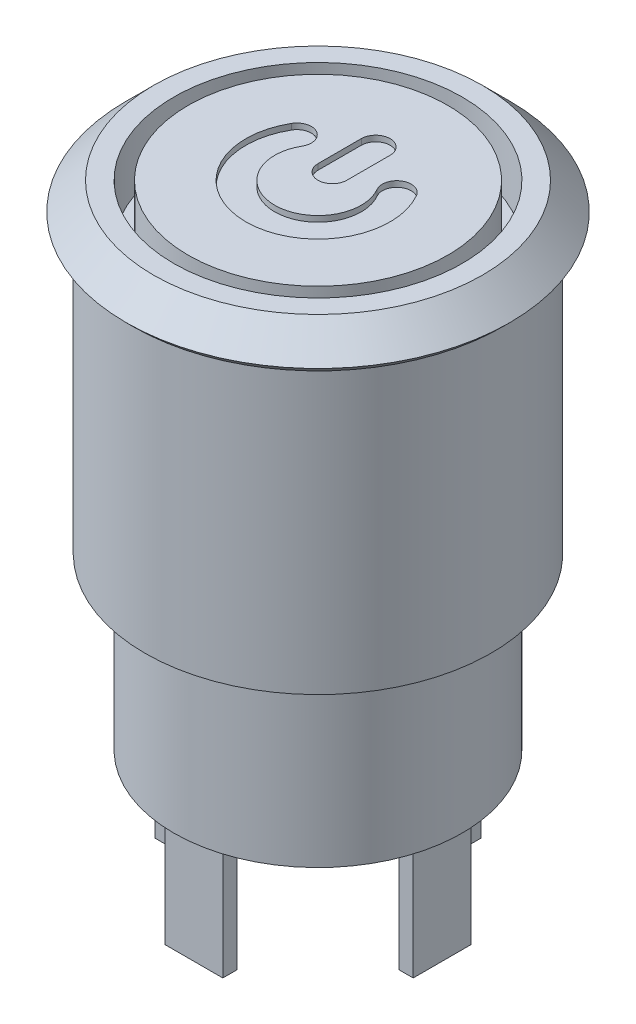
ISO-10303-21;
HEADER;
FILE_DESCRIPTION(('STEP AP214'),'2;1');
FILE_NAME('part.step','',(''),(''),'','','');
FILE_SCHEMA(('AUTOMOTIVE_DESIGN { 1 0 10303 214 1 1 1 1 }'));
ENDSEC;
DATA;
#1=APPLICATION_CONTEXT('core data for automotive mechanical design processes');
#2=APPLICATION_PROTOCOL_DEFINITION('international standard','automotive_design',2000,#1);
#3=PRODUCT_CONTEXT('',#1,'mechanical');
#4=PRODUCT('Part','Part','',(#3));
#5=PRODUCT_RELATED_PRODUCT_CATEGORY('part','',(#4));
#6=PRODUCT_DEFINITION_FORMATION('','',#4);
#7=PRODUCT_DEFINITION_CONTEXT('part definition',#1,'design');
#8=PRODUCT_DEFINITION('design','',#6,#7);
#9=PRODUCT_DEFINITION_SHAPE('','',#8);
#10=(LENGTH_UNIT() NAMED_UNIT(*) SI_UNIT(.MILLI.,.METRE.));
#11=(NAMED_UNIT(*) PLANE_ANGLE_UNIT() SI_UNIT($,.RADIAN.));
#12=(NAMED_UNIT(*) SI_UNIT($,.STERADIAN.) SOLID_ANGLE_UNIT());
#13=UNCERTAINTY_MEASURE_WITH_UNIT(LENGTH_MEASURE(1.E-05),#10,'distance_accuracy_value','');
#14=(GEOMETRIC_REPRESENTATION_CONTEXT(3) GLOBAL_UNCERTAINTY_ASSIGNED_CONTEXT((#13)) GLOBAL_UNIT_ASSIGNED_CONTEXT((#10,
#11,#12)) REPRESENTATION_CONTEXT('',''));
#15=CARTESIAN_POINT('',(0.,0.,0.));
#16=DIRECTION('',(0.,0.,1.));
#17=DIRECTION('',(1.,0.,0.));
#18=AXIS2_PLACEMENT_3D('',#15,#16,#17);
#19=CARTESIAN_POINT('',(0.,-5.9,0.));
#20=DIRECTION('',(0.,-1.,0.));
#21=DIRECTION('',(0.,0.,-1.));
#22=AXIS2_PLACEMENT_3D('',#19,#20,#21);
#23=PLANE('',#22);
#24=CARTESIAN_POINT('',(0.,-5.9,0.));
#25=DIRECTION('',(0.,-1.,0.));
#26=DIRECTION('',(0.,0.,-1.));
#27=AXIS2_PLACEMENT_3D('',#24,#25,#26);
#28=CIRCLE('',#27,5.);
#29=CARTESIAN_POINT('',(0.,-5.9,-5.));
#30=VERTEX_POINT('',#29);
#31=EDGE_CURVE('E319',#30,#30,#28,.T.);
#32=ORIENTED_EDGE('',*,*,#31,.T.);
#33=EDGE_LOOP('',(#32));
#34=FACE_BOUND('',#33,.T.);
#35=DIRECTION('',(-1.,0.,0.));
#36=VECTOR('',#35,1.);
#37=CARTESIAN_POINT('',(-1.,-5.9,4.3));
#38=LINE('',#37,#36);
#39=CARTESIAN_POINT('',(0.999999999999998,-5.9,4.3));
#40=VERTEX_POINT('',#39);
#41=CARTESIAN_POINT('',(-1.,-5.9,4.3));
#42=VERTEX_POINT('',#41);
#43=EDGE_CURVE('E304',#40,#42,#38,.T.);
#44=ORIENTED_EDGE('',*,*,#43,.F.);
#45=DIRECTION('',(0.,0.,1.));
#46=VECTOR('',#45,1.);
#47=CARTESIAN_POINT('',(0.999999999999998,-5.9,4.3));
#48=LINE('',#47,#46);
#49=CARTESIAN_POINT('',(0.999999999999999,-5.9,3.8));
#50=VERTEX_POINT('',#49);
#51=EDGE_CURVE('E290',#50,#40,#48,.T.);
#52=ORIENTED_EDGE('',*,*,#51,.F.);
#53=DIRECTION('',(1.,0.,0.));
#54=VECTOR('',#53,1.);
#55=CARTESIAN_POINT('',(-1.,-5.9,3.8));
#56=LINE('',#55,#54);
#57=CARTESIAN_POINT('',(-1.,-5.9,3.8));
#58=VERTEX_POINT('',#57);
#59=EDGE_CURVE('E295',#58,#50,#56,.T.);
#60=ORIENTED_EDGE('',*,*,#59,.F.);
#61=DIRECTION('',(0.,0.,-1.));
#62=VECTOR('',#61,1.);
#63=CARTESIAN_POINT('',(-1.,-5.9,4.3));
#64=LINE('',#63,#62);
#65=EDGE_CURVE('E306',#42,#58,#64,.T.);
#66=ORIENTED_EDGE('',*,*,#65,.F.);
#67=EDGE_LOOP('',(#44,#52,#60,#66));
#68=FACE_BOUND('',#67,.T.);
#69=DIRECTION('',(-1.,0.,0.));
#70=VECTOR('',#69,1.);
#71=CARTESIAN_POINT('',(-1.27706314817435,-5.9,-3.8));
#72=LINE('',#71,#70);
#73=CARTESIAN_POINT('',(1.27706314817435,-5.9,-3.8));
#74=VERTEX_POINT('',#73);
#75=CARTESIAN_POINT('',(-1.27706314817435,-5.9,-3.8));
#76=VERTEX_POINT('',#75);
#77=EDGE_CURVE('E275',#74,#76,#72,.T.);
#78=ORIENTED_EDGE('',*,*,#77,.F.);
#79=DIRECTION('',(0.,0.,1.));
#80=VECTOR('',#79,1.);
#81=CARTESIAN_POINT('',(1.27706314817435,-5.9,-3.8));
#82=LINE('',#81,#80);
#83=CARTESIAN_POINT('',(1.27706314817435,-5.9,-4.38101711650423));
#84=VERTEX_POINT('',#83);
#85=EDGE_CURVE('E261',#84,#74,#82,.T.);
#86=ORIENTED_EDGE('',*,*,#85,.F.);
#87=DIRECTION('',(1.,0.,0.));
#88=VECTOR('',#87,1.);
#89=CARTESIAN_POINT('',(-1.27706314817435,-5.9,-4.38101711650423));
#90=LINE('',#89,#88);
#91=CARTESIAN_POINT('',(-1.27706314817435,-5.9,-4.38101711650423));
#92=VERTEX_POINT('',#91);
#93=EDGE_CURVE('E266',#92,#84,#90,.T.);
#94=ORIENTED_EDGE('',*,*,#93,.F.);
#95=DIRECTION('',(0.,0.,-1.));
#96=VECTOR('',#95,1.);
#97=CARTESIAN_POINT('',(-1.27706314817435,-5.9,-3.8));
#98=LINE('',#97,#96);
#99=EDGE_CURVE('E277',#76,#92,#98,.T.);
#100=ORIENTED_EDGE('',*,*,#99,.F.);
#101=EDGE_LOOP('',(#78,#86,#94,#100));
#102=FACE_BOUND('',#101,.T.);
#103=DIRECTION('',(-1.37910516340156E-13,0.,1.));
#104=VECTOR('',#103,1.);
#105=CARTESIAN_POINT('',(4.30000000000034,-5.9,1.0000000000014));
#106=LINE('',#105,#104);
#107=CARTESIAN_POINT('',(4.30000000000061,-5.9,-0.999999999998596));
#108=VERTEX_POINT('',#107);
#109=CARTESIAN_POINT('',(4.30000000000034,-5.9,1.0000000000014));
#110=VERTEX_POINT('',#109);
#111=EDGE_CURVE('E233',#108,#110,#106,.T.);
#112=ORIENTED_EDGE('',*,*,#111,.F.);
#113=DIRECTION('',(1.,0.,1.37476835471162E-13));
#114=VECTOR('',#113,1.);
#115=CARTESIAN_POINT('',(4.30000000000061,-5.9,-0.999999999998596));
#116=LINE('',#115,#114);
#117=CARTESIAN_POINT('',(3.80000000000061,-5.9,-0.999999999998665));
#118=VERTEX_POINT('',#117);
#119=EDGE_CURVE('E230',#118,#108,#116,.T.);
#120=ORIENTED_EDGE('',*,*,#119,.F.);
#121=DIRECTION('',(1.37693675905659E-13,0.,-1.));
#122=VECTOR('',#121,1.);
#123=CARTESIAN_POINT('',(3.80000000000034,-5.9,1.00000000000134));
#124=LINE('',#123,#122);
#125=CARTESIAN_POINT('',(3.80000000000034,-5.9,1.00000000000134));
#126=VERTEX_POINT('',#125);
#127=EDGE_CURVE('E242',#126,#118,#124,.T.);
#128=ORIENTED_EDGE('',*,*,#127,.F.);
#129=DIRECTION('',(-1.,0.,-1.37476835471162E-13));
#130=VECTOR('',#129,1.);
#131=CARTESIAN_POINT('',(4.30000000000034,-5.9,1.0000000000014));
#132=LINE('',#131,#130);
#133=EDGE_CURVE('E250',#110,#126,#132,.T.);
#134=ORIENTED_EDGE('',*,*,#133,.F.);
#135=EDGE_LOOP('',(#112,#120,#128,#134));
#136=FACE_BOUND('',#135,.T.);
#137=DIRECTION('',(1.,0.,1.38087086395404E-13));
#138=VECTOR('',#137,1.);
#139=CARTESIAN_POINT('',(-3.79999999999935,-5.9,-1.27706314817406));
#140=LINE('',#139,#138);
#141=CARTESIAN_POINT('',(-4.38101711650357,-5.9,-1.27706314817414));
#142=VERTEX_POINT('',#141);
#143=CARTESIAN_POINT('',(-3.79999999999935,-5.9,-1.27706314817406));
#144=VERTEX_POINT('',#143);
#145=EDGE_CURVE('E852',#142,#144,#140,.T.);
#146=ORIENTED_EDGE('',*,*,#145,.F.);
#147=DIRECTION('',(1.37874492004061E-13,0.,-1.));
#148=VECTOR('',#147,1.);
#149=CARTESIAN_POINT('',(-4.38101711650393,-5.9,1.27706314817456));
#150=LINE('',#149,#148);
#151=CARTESIAN_POINT('',(-4.38101711650393,-5.9,1.27706314817456));
#152=VERTEX_POINT('',#151);
#153=EDGE_CURVE('E228',#152,#142,#150,.T.);
#154=ORIENTED_EDGE('',*,*,#153,.F.);
#155=DIRECTION('',(-1.,0.,-1.37713878053795E-13));
#156=VECTOR('',#155,1.);
#157=CARTESIAN_POINT('',(-3.7999999999997,-5.9,1.27706314817464));
#158=LINE('',#157,#156);
#159=CARTESIAN_POINT('',(-3.7999999999997,-5.9,1.27706314817464));
#160=VERTEX_POINT('',#159);
#161=EDGE_CURVE('E224',#160,#152,#158,.T.);
#162=ORIENTED_EDGE('',*,*,#161,.F.);
#163=DIRECTION('',(-1.37874492004061E-13,0.,1.));
#164=VECTOR('',#163,1.);
#165=CARTESIAN_POINT('',(-3.7999999999997,-5.9,1.27706314817464));
#166=LINE('',#165,#164);
#167=EDGE_CURVE('E849',#144,#160,#166,.T.);
#168=ORIENTED_EDGE('',*,*,#167,.F.);
#169=EDGE_LOOP('',(#146,#154,#162,#168));
#170=FACE_BOUND('',#169,.T.);
#171=ADVANCED_FACE('F41',(#34,#68,#102,#136,#170),#23,.T.);
#172=CARTESIAN_POINT('',(0.,10.,0.));
#173=DIRECTION('',(0.,-1.,0.));
#174=DIRECTION('',(0.,0.,-1.));
#175=AXIS2_PLACEMENT_3D('',#172,#173,#174);
#176=CYLINDRICAL_SURFACE('',#175,6.);
#177=CARTESIAN_POINT('',(0.,10.,0.));
#178=DIRECTION('',(0.,1.,0.));
#179=DIRECTION('',(0.,0.,1.));
#180=AXIS2_PLACEMENT_3D('',#177,#178,#179);
#181=CIRCLE('',#180,6.);
#182=CARTESIAN_POINT('',(0.,10.,6.));
#183=VERTEX_POINT('',#182);
#184=EDGE_CURVE('E441',#183,#183,#181,.T.);
#185=ORIENTED_EDGE('',*,*,#184,.F.);
#186=EDGE_LOOP('',(#185));
#187=FACE_BOUND('',#186,.T.);
#188=CARTESIAN_POINT('',(0.,0.,0.));
#189=DIRECTION('',(0.,1.,0.));
#190=DIRECTION('',(0.,0.,1.));
#191=AXIS2_PLACEMENT_3D('',#188,#189,#190);
#192=CIRCLE('',#191,6.);
#193=CARTESIAN_POINT('',(0.,0.,6.));
#194=VERTEX_POINT('',#193);
#195=EDGE_CURVE('E444',#194,#194,#192,.T.);
#196=ORIENTED_EDGE('',*,*,#195,.T.);
#197=EDGE_LOOP('',(#196));
#198=FACE_BOUND('',#197,.T.);
#199=ADVANCED_FACE('F428',(#187,#198),#176,.T.);
#200=CARTESIAN_POINT('',(0.,0.,0.));
#201=DIRECTION('',(0.,1.,0.));
#202=DIRECTION('',(0.,0.,1.));
#203=AXIS2_PLACEMENT_3D('',#200,#201,#202);
#204=PLANE('',#203);
#205=CARTESIAN_POINT('',(0.,0.,0.));
#206=DIRECTION('',(0.,-1.,0.));
#207=DIRECTION('',(0.,0.,-1.));
#208=AXIS2_PLACEMENT_3D('',#205,#206,#207);
#209=CIRCLE('',#208,5.);
#210=CARTESIAN_POINT('',(0.,0.,-5.));
#211=VERTEX_POINT('',#210);
#212=EDGE_CURVE('E12',#211,#211,#209,.T.);
#213=ORIENTED_EDGE('',*,*,#212,.F.);
#214=EDGE_LOOP('',(#213));
#215=FACE_BOUND('',#214,.T.);
#216=ORIENTED_EDGE('',*,*,#195,.F.);
#217=EDGE_LOOP('',(#216));
#218=FACE_BOUND('',#217,.T.);
#219=ADVANCED_FACE('F425',(#215,#218),#204,.F.);
#220=CARTESIAN_POINT('',(0.,10.,0.));
#221=DIRECTION('',(0.,1.,0.));
#222=DIRECTION('',(0.,0.,1.));
#223=AXIS2_PLACEMENT_3D('',#220,#221,#222);
#224=PLANE('',#223);
#225=CARTESIAN_POINT('',(0.,10.,0.));
#226=DIRECTION('',(0.,1.,0.));
#227=DIRECTION('',(0.,0.,1.));
#228=AXIS2_PLACEMENT_3D('',#225,#226,#227);
#229=CIRCLE('',#228,6.4);
#230=CARTESIAN_POINT('',(0.,10.,6.4));
#231=VERTEX_POINT('',#230);
#232=EDGE_CURVE('E46',#231,#231,#229,.F.);
#233=ORIENTED_EDGE('',*,*,#232,.T.);
#234=EDGE_LOOP('',(#233));
#235=FACE_BOUND('',#234,.T.);
#236=ORIENTED_EDGE('',*,*,#184,.T.);
#237=EDGE_LOOP('',(#236));
#238=FACE_BOUND('',#237,.T.);
#239=ADVANCED_FACE('F422',(#235,#238),#224,.F.);
#240=CARTESIAN_POINT('',(0.,11.2,0.));
#241=DIRECTION('',(0.,1.,0.));
#242=DIRECTION('',(0.,0.,1.));
#243=AXIS2_PLACEMENT_3D('',#240,#241,#242);
#244=PLANE('',#243);
#245=CARTESIAN_POINT('',(0.,11.2,0.));
#246=DIRECTION('',(0.,1.,0.));
#247=DIRECTION('',(0.,0.,1.));
#248=AXIS2_PLACEMENT_3D('',#245,#246,#247);
#249=CIRCLE('',#248,5.);
#250=CARTESIAN_POINT('',(0.,11.2,5.));
#251=VERTEX_POINT('',#250);
#252=EDGE_CURVE('E390',#251,#251,#249,.T.);
#253=ORIENTED_EDGE('',*,*,#252,.F.);
#254=EDGE_LOOP('',(#253));
#255=FACE_BOUND('',#254,.T.);
#256=CARTESIAN_POINT('',(0.,11.2,0.));
#257=DIRECTION('',(0.,1.,0.));
#258=DIRECTION('',(0.,0.,1.));
#259=AXIS2_PLACEMENT_3D('',#256,#257,#258);
#260=CIRCLE('',#259,5.7);
#261=CARTESIAN_POINT('',(0.,11.2,5.7));
#262=VERTEX_POINT('',#261);
#263=EDGE_CURVE('E396',#262,#262,#260,.T.);
#264=ORIENTED_EDGE('',*,*,#263,.T.);
#265=EDGE_LOOP('',(#264));
#266=FACE_BOUND('',#265,.T.);
#267=ADVANCED_FACE('F418',(#255,#266),#244,.T.);
#268=CARTESIAN_POINT('',(0.,11.2,0.));
#269=DIRECTION('',(0.,-1.,0.));
#270=DIRECTION('',(0.,0.,-1.));
#271=AXIS2_PLACEMENT_3D('',#268,#269,#270);
#272=CONICAL_SURFACE('',#271,5.7,0.785398163397449);
#273=CARTESIAN_POINT('',(0.,10.25,0.));
#274=DIRECTION('',(0.,-1.,0.));
#275=DIRECTION('',(0.,0.,-1.));
#276=AXIS2_PLACEMENT_3D('',#273,#274,#275);
#277=CIRCLE('',#276,6.65);
#278=CARTESIAN_POINT('',(0.,10.25,-6.65));
#279=VERTEX_POINT('',#278);
#280=EDGE_CURVE('E447',#279,#279,#277,.F.);
#281=ORIENTED_EDGE('',*,*,#280,.T.);
#282=EDGE_LOOP('',(#281));
#283=FACE_BOUND('',#282,.T.);
#284=ORIENTED_EDGE('',*,*,#263,.F.);
#285=EDGE_LOOP('',(#284));
#286=FACE_BOUND('',#285,.T.);
#287=ADVANCED_FACE('F408',(#283,#286),#272,.T.);
#288=CARTESIAN_POINT('',(0.,10.25,0.));
#289=DIRECTION('',(0.,1.,0.));
#290=DIRECTION('',(0.,0.,1.));
#291=AXIS2_PLACEMENT_3D('',#288,#289,#290);
#292=CONICAL_SURFACE('',#291,6.65,0.785398163397448);
#293=ORIENTED_EDGE('',*,*,#232,.F.);
#294=EDGE_LOOP('',(#293));
#295=FACE_BOUND('',#294,.T.);
#296=ORIENTED_EDGE('',*,*,#280,.F.);
#297=EDGE_LOOP('',(#296));
#298=FACE_BOUND('',#297,.T.);
#299=ADVANCED_FACE('F44',(#295,#298),#292,.T.);
#300=CARTESIAN_POINT('',(0.,9.2,0.));
#301=DIRECTION('',(0.,1.,0.));
#302=DIRECTION('',(0.,0.,1.));
#303=AXIS2_PLACEMENT_3D('',#300,#301,#302);
#304=CYLINDRICAL_SURFACE('',#303,5.);
#305=CARTESIAN_POINT('',(0.,9.2,0.));
#306=DIRECTION('',(0.,1.,0.));
#307=DIRECTION('',(0.,0.,1.));
#308=AXIS2_PLACEMENT_3D('',#305,#306,#307);
#309=CIRCLE('',#308,5.);
#310=CARTESIAN_POINT('',(0.,9.2,5.));
#311=VERTEX_POINT('',#310);
#312=EDGE_CURVE('E393',#311,#311,#309,.T.);
#313=ORIENTED_EDGE('',*,*,#312,.F.);
#314=EDGE_LOOP('',(#313));
#315=FACE_BOUND('',#314,.T.);
#316=ORIENTED_EDGE('',*,*,#252,.T.);
#317=EDGE_LOOP('',(#316));
#318=FACE_BOUND('',#317,.T.);
#319=ADVANCED_FACE('F459',(#315,#318),#304,.F.);
#320=CARTESIAN_POINT('',(0.,9.2,0.));
#321=DIRECTION('',(0.,1.,0.));
#322=DIRECTION('',(0.,0.,1.));
#323=AXIS2_PLACEMENT_3D('',#320,#321,#322);
#324=PLANE('',#323);
#325=CARTESIAN_POINT('',(0.,9.2,0.));
#326=DIRECTION('',(0.,1.,0.));
#327=DIRECTION('',(0.,0.,1.));
#328=AXIS2_PLACEMENT_3D('',#325,#326,#327);
#329=CIRCLE('',#328,4.5);
#330=CARTESIAN_POINT('',(0.,9.2,4.5));
#331=VERTEX_POINT('',#330);
#332=EDGE_CURVE('E380',#331,#331,#329,.T.);
#333=ORIENTED_EDGE('',*,*,#332,.F.);
#334=EDGE_LOOP('',(#333));
#335=FACE_BOUND('',#334,.T.);
#336=ORIENTED_EDGE('',*,*,#312,.T.);
#337=EDGE_LOOP('',(#336));
#338=FACE_BOUND('',#337,.T.);
#339=ADVANCED_FACE('F463',(#335,#338),#324,.T.);
#340=CARTESIAN_POINT('',(0.,11.2,0.));
#341=DIRECTION('',(0.,-1.,0.));
#342=DIRECTION('',(0.,0.,-1.));
#343=AXIS2_PLACEMENT_3D('',#340,#341,#342);
#344=CYLINDRICAL_SURFACE('',#343,4.5);
#345=CARTESIAN_POINT('',(0.,11.2,0.));
#346=DIRECTION('',(0.,1.,0.));
#347=DIRECTION('',(0.,0.,1.));
#348=AXIS2_PLACEMENT_3D('',#345,#346,#347);
#349=CIRCLE('',#348,4.5);
#350=CARTESIAN_POINT('',(0.,11.2,4.5));
#351=VERTEX_POINT('',#350);
#352=EDGE_CURVE('E387',#351,#351,#349,.T.);
#353=ORIENTED_EDGE('',*,*,#352,.F.);
#354=EDGE_LOOP('',(#353));
#355=FACE_BOUND('',#354,.T.);
#356=ORIENTED_EDGE('',*,*,#332,.T.);
#357=EDGE_LOOP('',(#356));
#358=FACE_BOUND('',#357,.T.);
#359=ADVANCED_FACE('F468',(#355,#358),#344,.T.);
#360=CARTESIAN_POINT('',(0.,11.2,0.));
#361=DIRECTION('',(0.,1.,0.));
#362=DIRECTION('',(0.,0.,1.));
#363=AXIS2_PLACEMENT_3D('',#360,#361,#362);
#364=PLANE('',#363);
#365=CARTESIAN_POINT('',(-1.73205080756888,11.2,-0.999999999999995));
#366=DIRECTION('',(0.,1.,0.));
#367=DIRECTION('',(0.,0.,-1.));
#368=AXIS2_PLACEMENT_3D('',#365,#366,#367);
#369=CIRCLE('',#368,0.5);
#370=CARTESIAN_POINT('',(-1.29903810567666,11.2,-0.749999999999997));
#371=VERTEX_POINT('',#370);
#372=CARTESIAN_POINT('',(-2.1650635094611,11.2,-1.25));
#373=VERTEX_POINT('',#372);
#374=EDGE_CURVE('E321',#371,#373,#369,.T.);
#375=ORIENTED_EDGE('',*,*,#374,.F.);
#376=CARTESIAN_POINT('',(0.,11.2,0.));
#377=DIRECTION('',(0.,-1.,0.));
#378=DIRECTION('',(0.,0.,1.));
#379=AXIS2_PLACEMENT_3D('',#376,#377,#378);
#380=CIRCLE('',#379,1.5);
#381=CARTESIAN_POINT('',(1.29903810567666,11.2,-0.749999999999997));
#382=VERTEX_POINT('',#381);
#383=EDGE_CURVE('E327',#382,#371,#380,.T.);
#384=ORIENTED_EDGE('',*,*,#383,.F.);
#385=CARTESIAN_POINT('',(1.73205080756888,11.2,-0.999999999999996));
#386=DIRECTION('',(0.,1.,0.));
#387=DIRECTION('',(0.,0.,1.));
#388=AXIS2_PLACEMENT_3D('',#385,#386,#387);
#389=CIRCLE('',#388,0.5);
#390=CARTESIAN_POINT('',(2.1650635094611,11.2,-1.24999999999999));
#391=VERTEX_POINT('',#390);
#392=EDGE_CURVE('E341',#391,#382,#389,.T.);
#393=ORIENTED_EDGE('',*,*,#392,.F.);
#394=CARTESIAN_POINT('',(0.,11.2,0.));
#395=DIRECTION('',(0.,1.,0.));
#396=DIRECTION('',(0.,0.,1.));
#397=AXIS2_PLACEMENT_3D('',#394,#395,#396);
#398=CIRCLE('',#397,2.5);
#399=EDGE_CURVE('E338',#373,#391,#398,.T.);
#400=ORIENTED_EDGE('',*,*,#399,.F.);
#401=EDGE_LOOP('',(#375,#384,#393,#400));
#402=FACE_BOUND('',#401,.T.);
#403=CARTESIAN_POINT('',(0.,11.2,-0.5));
#404=DIRECTION('',(0.,1.,0.));
#405=DIRECTION('',(0.,0.,-1.));
#406=AXIS2_PLACEMENT_3D('',#403,#404,#405);
#407=CIRCLE('',#406,0.5);
#408=CARTESIAN_POINT('',(-0.5,11.2,-0.5));
#409=VERTEX_POINT('',#408);
#410=CARTESIAN_POINT('',(0.5,11.2,-0.5));
#411=VERTEX_POINT('',#410);
#412=EDGE_CURVE('E348',#409,#411,#407,.T.);
#413=ORIENTED_EDGE('',*,*,#412,.F.);
#414=DIRECTION('',(0.,0.,1.));
#415=VECTOR('',#414,1.);
#416=CARTESIAN_POINT('',(-0.5,11.2,-0.5));
#417=LINE('',#416,#415);
#418=CARTESIAN_POINT('',(-0.5,11.2,-2.));
#419=VERTEX_POINT('',#418);
#420=EDGE_CURVE('E359',#419,#409,#417,.T.);
#421=ORIENTED_EDGE('',*,*,#420,.F.);
#422=CARTESIAN_POINT('',(0.,11.2,-2.));
#423=DIRECTION('',(0.,1.,0.));
#424=DIRECTION('',(0.,0.,-1.));
#425=AXIS2_PLACEMENT_3D('',#422,#423,#424);
#426=CIRCLE('',#425,0.5);
#427=CARTESIAN_POINT('',(0.5,11.2,-2.));
#428=VERTEX_POINT('',#427);
#429=EDGE_CURVE('E373',#428,#419,#426,.T.);
#430=ORIENTED_EDGE('',*,*,#429,.F.);
#431=DIRECTION('',(0.,0.,-1.));
#432=VECTOR('',#431,1.);
#433=CARTESIAN_POINT('',(0.5,11.2,-0.5));
#434=LINE('',#433,#432);
#435=EDGE_CURVE('E370',#411,#428,#434,.T.);
#436=ORIENTED_EDGE('',*,*,#435,.F.);
#437=EDGE_LOOP('',(#413,#421,#430,#436));
#438=FACE_BOUND('',#437,.T.);
#439=ORIENTED_EDGE('',*,*,#352,.T.);
#440=EDGE_LOOP('',(#439));
#441=FACE_BOUND('',#440,.T.);
#442=ADVANCED_FACE('F476',(#402,#438,#441),#364,.T.);
#443=CARTESIAN_POINT('',(0.,11.,-0.5));
#444=DIRECTION('',(0.,1.,0.));
#445=DIRECTION('',(0.,0.,1.));
#446=AXIS2_PLACEMENT_3D('',#443,#444,#445);
#447=CYLINDRICAL_SURFACE('',#446,0.5);
#448=ORIENTED_EDGE('',*,*,#412,.T.);
#449=DIRECTION('',(0.,1.,0.));
#450=VECTOR('',#449,1.);
#451=CARTESIAN_POINT('',(0.5,11.,-0.5));
#452=LINE('',#451,#450);
#453=CARTESIAN_POINT('',(0.5,11.,-0.5));
#454=VERTEX_POINT('',#453);
#455=EDGE_CURVE('E368',#454,#411,#452,.T.);
#456=ORIENTED_EDGE('',*,*,#455,.F.);
#457=CARTESIAN_POINT('',(0.,11.,-0.5));
#458=DIRECTION('',(0.,1.,0.));
#459=DIRECTION('',(0.,0.,-1.));
#460=AXIS2_PLACEMENT_3D('',#457,#458,#459);
#461=CIRCLE('',#460,0.5);
#462=CARTESIAN_POINT('',(-0.5,11.,-0.5));
#463=VERTEX_POINT('',#462);
#464=EDGE_CURVE('E355',#463,#454,#461,.T.);
#465=ORIENTED_EDGE('',*,*,#464,.F.);
#466=DIRECTION('',(0.,1.,0.));
#467=VECTOR('',#466,1.);
#468=CARTESIAN_POINT('',(-0.5,11.,-0.5));
#469=LINE('',#468,#467);
#470=EDGE_CURVE('E378',#463,#409,#469,.T.);
#471=ORIENTED_EDGE('',*,*,#470,.T.);
#472=EDGE_LOOP('',(#448,#456,#465,#471));
#473=FACE_BOUND('',#472,.T.);
#474=ADVANCED_FACE('F480',(#473),#447,.F.);
#475=CARTESIAN_POINT('',(-0.5,11.,-0.5));
#476=DIRECTION('',(-1.,0.,0.));
#477=DIRECTION('',(0.,0.,1.));
#478=AXIS2_PLACEMENT_3D('',#475,#476,#477);
#479=PLANE('',#478);
#480=ORIENTED_EDGE('',*,*,#420,.T.);
#481=ORIENTED_EDGE('',*,*,#470,.F.);
#482=DIRECTION('',(0.,0.,1.));
#483=VECTOR('',#482,1.);
#484=CARTESIAN_POINT('',(-0.5,11.,-0.5));
#485=LINE('',#484,#483);
#486=CARTESIAN_POINT('',(-0.5,11.,-2.));
#487=VERTEX_POINT('',#486);
#488=EDGE_CURVE('E365',#487,#463,#485,.T.);
#489=ORIENTED_EDGE('',*,*,#488,.F.);
#490=DIRECTION('',(0.,1.,0.));
#491=VECTOR('',#490,1.);
#492=CARTESIAN_POINT('',(-0.5,11.,-2.));
#493=LINE('',#492,#491);
#494=EDGE_CURVE('E381',#487,#419,#493,.T.);
#495=ORIENTED_EDGE('',*,*,#494,.T.);
#496=EDGE_LOOP('',(#480,#481,#489,#495));
#497=FACE_BOUND('',#496,.T.);
#498=ADVANCED_FACE('F484',(#497),#479,.F.);
#499=CARTESIAN_POINT('',(0.,11.,-2.));
#500=DIRECTION('',(0.,1.,0.));
#501=DIRECTION('',(0.,0.,1.));
#502=AXIS2_PLACEMENT_3D('',#499,#500,#501);
#503=CYLINDRICAL_SURFACE('',#502,0.5);
#504=ORIENTED_EDGE('',*,*,#429,.T.);
#505=ORIENTED_EDGE('',*,*,#494,.F.);
#506=CARTESIAN_POINT('',(0.,11.,-2.));
#507=DIRECTION('',(0.,1.,0.));
#508=DIRECTION('',(0.,0.,-1.));
#509=AXIS2_PLACEMENT_3D('',#506,#507,#508);
#510=CIRCLE('',#509,0.5);
#511=CARTESIAN_POINT('',(0.5,11.,-2.));
#512=VERTEX_POINT('',#511);
#513=EDGE_CURVE('E362',#512,#487,#510,.T.);
#514=ORIENTED_EDGE('',*,*,#513,.F.);
#515=DIRECTION('',(0.,1.,0.));
#516=VECTOR('',#515,1.);
#517=CARTESIAN_POINT('',(0.5,11.,-2.));
#518=LINE('',#517,#516);
#519=EDGE_CURVE('E383',#512,#428,#518,.T.);
#520=ORIENTED_EDGE('',*,*,#519,.T.);
#521=EDGE_LOOP('',(#504,#505,#514,#520));
#522=FACE_BOUND('',#521,.T.);
#523=ADVANCED_FACE('F490',(#522),#503,.F.);
#524=CARTESIAN_POINT('',(0.5,11.,-0.5));
#525=DIRECTION('',(1.,0.,0.));
#526=DIRECTION('',(0.,0.,-1.));
#527=AXIS2_PLACEMENT_3D('',#524,#525,#526);
#528=PLANE('',#527);
#529=ORIENTED_EDGE('',*,*,#435,.T.);
#530=ORIENTED_EDGE('',*,*,#519,.F.);
#531=DIRECTION('',(0.,0.,-1.));
#532=VECTOR('',#531,1.);
#533=CARTESIAN_POINT('',(0.5,11.,-0.5));
#534=LINE('',#533,#532);
#535=EDGE_CURVE('E358',#454,#512,#534,.T.);
#536=ORIENTED_EDGE('',*,*,#535,.F.);
#537=ORIENTED_EDGE('',*,*,#455,.T.);
#538=EDGE_LOOP('',(#529,#530,#536,#537));
#539=FACE_BOUND('',#538,.T.);
#540=ADVANCED_FACE('F486',(#539),#528,.F.);
#541=CARTESIAN_POINT('',(0.,11.,-0.5));
#542=DIRECTION('',(0.,-1.,0.));
#543=DIRECTION('',(0.,0.,-1.));
#544=AXIS2_PLACEMENT_3D('',#541,#542,#543);
#545=PLANE('',#544);
#546=ORIENTED_EDGE('',*,*,#464,.T.);
#547=ORIENTED_EDGE('',*,*,#535,.T.);
#548=ORIENTED_EDGE('',*,*,#513,.T.);
#549=ORIENTED_EDGE('',*,*,#488,.T.);
#550=EDGE_LOOP('',(#546,#547,#548,#549));
#551=FACE_BOUND('',#550,.T.);
#552=ADVANCED_FACE('F489',(#551),#545,.F.);
#553=CARTESIAN_POINT('',(-1.73205080756888,11.,-0.999999999999995));
#554=DIRECTION('',(0.,1.,0.));
#555=DIRECTION('',(0.,0.,1.));
#556=AXIS2_PLACEMENT_3D('',#553,#554,#555);
#557=CYLINDRICAL_SURFACE('',#556,0.5);
#558=ORIENTED_EDGE('',*,*,#374,.T.);
#559=DIRECTION('',(0.,1.,0.));
#560=VECTOR('',#559,1.);
#561=CARTESIAN_POINT('',(-2.1650635094611,11.,-1.25));
#562=LINE('',#561,#560);
#563=CARTESIAN_POINT('',(-2.1650635094611,11.,-1.25));
#564=VERTEX_POINT('',#563);
#565=EDGE_CURVE('E336',#564,#373,#562,.T.);
#566=ORIENTED_EDGE('',*,*,#565,.F.);
#567=CARTESIAN_POINT('',(-1.73205080756888,11.,-0.999999999999995));
#568=DIRECTION('',(0.,1.,0.));
#569=DIRECTION('',(0.,0.,-1.));
#570=AXIS2_PLACEMENT_3D('',#567,#568,#569);
#571=CIRCLE('',#570,0.5);
#572=CARTESIAN_POINT('',(-1.29903810567666,11.,-0.749999999999997));
#573=VERTEX_POINT('',#572);
#574=EDGE_CURVE('E323',#573,#564,#571,.T.);
#575=ORIENTED_EDGE('',*,*,#574,.F.);
#576=DIRECTION('',(0.,1.,0.));
#577=VECTOR('',#576,1.);
#578=CARTESIAN_POINT('',(-1.29903810567666,11.,-0.749999999999997));
#579=LINE('',#578,#577);
#580=EDGE_CURVE('E346',#573,#371,#579,.T.);
#581=ORIENTED_EDGE('',*,*,#580,.T.);
#582=EDGE_LOOP('',(#558,#566,#575,#581));
#583=FACE_BOUND('',#582,.T.);
#584=ADVANCED_FACE('F500',(#583),#557,.F.);
#585=CARTESIAN_POINT('',(0.,11.,0.));
#586=DIRECTION('',(0.,1.,0.));
#587=DIRECTION('',(0.,0.,1.));
#588=AXIS2_PLACEMENT_3D('',#585,#586,#587);
#589=CYLINDRICAL_SURFACE('',#588,1.5);
#590=ORIENTED_EDGE('',*,*,#383,.T.);
#591=ORIENTED_EDGE('',*,*,#580,.F.);
#592=CARTESIAN_POINT('',(0.,11.,0.));
#593=DIRECTION('',(0.,-1.,0.));
#594=DIRECTION('',(0.,0.,1.));
#595=AXIS2_PLACEMENT_3D('',#592,#593,#594);
#596=CIRCLE('',#595,1.5);
#597=CARTESIAN_POINT('',(1.29903810567666,11.,-0.749999999999997));
#598=VERTEX_POINT('',#597);
#599=EDGE_CURVE('E333',#598,#573,#596,.T.);
#600=ORIENTED_EDGE('',*,*,#599,.F.);
#601=DIRECTION('',(0.,1.,0.));
#602=VECTOR('',#601,1.);
#603=CARTESIAN_POINT('',(1.29903810567666,11.,-0.749999999999997));
#604=LINE('',#603,#602);
#605=EDGE_CURVE('E349',#598,#382,#604,.T.);
#606=ORIENTED_EDGE('',*,*,#605,.T.);
#607=EDGE_LOOP('',(#590,#591,#600,#606));
#608=FACE_BOUND('',#607,.T.);
#609=ADVANCED_FACE('F504',(#608),#589,.T.);
#610=CARTESIAN_POINT('',(1.73205080756888,11.,-0.999999999999996));
#611=DIRECTION('',(0.,1.,0.));
#612=DIRECTION('',(0.,0.,1.));
#613=AXIS2_PLACEMENT_3D('',#610,#611,#612);
#614=CYLINDRICAL_SURFACE('',#613,0.5);
#615=ORIENTED_EDGE('',*,*,#392,.T.);
#616=ORIENTED_EDGE('',*,*,#605,.F.);
#617=CARTESIAN_POINT('',(1.73205080756888,11.,-0.999999999999996));
#618=DIRECTION('',(0.,1.,0.));
#619=DIRECTION('',(0.,0.,1.));
#620=AXIS2_PLACEMENT_3D('',#617,#618,#619);
#621=CIRCLE('',#620,0.5);
#622=CARTESIAN_POINT('',(2.1650635094611,11.,-1.24999999999999));
#623=VERTEX_POINT('',#622);
#624=EDGE_CURVE('E330',#623,#598,#621,.T.);
#625=ORIENTED_EDGE('',*,*,#624,.F.);
#626=DIRECTION('',(0.,1.,0.));
#627=VECTOR('',#626,1.);
#628=CARTESIAN_POINT('',(2.1650635094611,11.,-1.24999999999999));
#629=LINE('',#628,#627);
#630=EDGE_CURVE('E351',#623,#391,#629,.T.);
#631=ORIENTED_EDGE('',*,*,#630,.T.);
#632=EDGE_LOOP('',(#615,#616,#625,#631));
#633=FACE_BOUND('',#632,.T.);
#634=ADVANCED_FACE('F510',(#633),#614,.F.);
#635=CARTESIAN_POINT('',(0.,11.,0.));
#636=DIRECTION('',(0.,1.,0.));
#637=DIRECTION('',(0.,0.,1.));
#638=AXIS2_PLACEMENT_3D('',#635,#636,#637);
#639=CYLINDRICAL_SURFACE('',#638,2.5);
#640=ORIENTED_EDGE('',*,*,#399,.T.);
#641=ORIENTED_EDGE('',*,*,#630,.F.);
#642=CARTESIAN_POINT('',(0.,11.,0.));
#643=DIRECTION('',(0.,1.,0.));
#644=DIRECTION('',(0.,0.,1.));
#645=AXIS2_PLACEMENT_3D('',#642,#643,#644);
#646=CIRCLE('',#645,2.5);
#647=EDGE_CURVE('E326',#564,#623,#646,.T.);
#648=ORIENTED_EDGE('',*,*,#647,.F.);
#649=ORIENTED_EDGE('',*,*,#565,.T.);
#650=EDGE_LOOP('',(#640,#641,#648,#649));
#651=FACE_BOUND('',#650,.T.);
#652=ADVANCED_FACE('F506',(#651),#639,.F.);
#653=CARTESIAN_POINT('',(-0.86602540378444,11.,-0.499999999999998));
#654=DIRECTION('',(0.,-1.,0.));
#655=DIRECTION('',(0.,0.,-1.));
#656=AXIS2_PLACEMENT_3D('',#653,#654,#655);
#657=PLANE('',#656);
#658=ORIENTED_EDGE('',*,*,#574,.T.);
#659=ORIENTED_EDGE('',*,*,#647,.T.);
#660=ORIENTED_EDGE('',*,*,#624,.T.);
#661=ORIENTED_EDGE('',*,*,#599,.T.);
#662=EDGE_LOOP('',(#658,#659,#660,#661));
#663=FACE_BOUND('',#662,.T.);
#664=ADVANCED_FACE('F509',(#663),#657,.F.);
#665=CARTESIAN_POINT('',(0.,-5.9,0.));
#666=DIRECTION('',(0.,1.,0.));
#667=DIRECTION('',(0.,0.,1.));
#668=AXIS2_PLACEMENT_3D('',#665,#666,#667);
#669=CYLINDRICAL_SURFACE('',#668,5.);
#670=ORIENTED_EDGE('',*,*,#31,.F.);
#671=EDGE_LOOP('',(#670));
#672=FACE_BOUND('',#671,.T.);
#673=ORIENTED_EDGE('',*,*,#212,.T.);
#674=EDGE_LOOP('',(#673));
#675=FACE_BOUND('',#674,.T.);
#676=ADVANCED_FACE('F520',(#672,#675),#669,.T.);
#677=CARTESIAN_POINT('',(0.999999999999998,-10.1,4.3));
#678=DIRECTION('',(-1.,0.,0.));
#679=DIRECTION('',(0.,0.,1.));
#680=AXIS2_PLACEMENT_3D('',#677,#678,#679);
#681=PLANE('',#680);
#682=ORIENTED_EDGE('',*,*,#51,.T.);
#683=DIRECTION('',(0.,1.,0.));
#684=VECTOR('',#683,1.);
#685=CARTESIAN_POINT('',(0.999999999999998,-10.1,4.3));
#686=LINE('',#685,#684);
#687=CARTESIAN_POINT('',(0.999999999999998,-10.1,4.3));
#688=VERTEX_POINT('',#687);
#689=EDGE_CURVE('E317',#688,#40,#686,.T.);
#690=ORIENTED_EDGE('',*,*,#689,.F.);
#691=DIRECTION('',(0.,0.,1.));
#692=VECTOR('',#691,1.);
#693=CARTESIAN_POINT('',(0.999999999999998,-10.1,4.3));
#694=LINE('',#693,#692);
#695=CARTESIAN_POINT('',(0.999999999999999,-10.1,3.8));
#696=VERTEX_POINT('',#695);
#697=EDGE_CURVE('E291',#696,#688,#694,.T.);
#698=ORIENTED_EDGE('',*,*,#697,.F.);
#699=DIRECTION('',(0.,1.,0.));
#700=VECTOR('',#699,1.);
#701=CARTESIAN_POINT('',(0.999999999999999,-10.1,3.8));
#702=LINE('',#701,#700);
#703=EDGE_CURVE('E301',#696,#50,#702,.T.);
#704=ORIENTED_EDGE('',*,*,#703,.T.);
#705=EDGE_LOOP('',(#682,#690,#698,#704));
#706=FACE_BOUND('',#705,.T.);
#707=ADVANCED_FACE('F523',(#706),#681,.F.);
#708=CARTESIAN_POINT('',(-1.,-10.1,4.3));
#709=DIRECTION('',(0.,0.,-1.));
#710=DIRECTION('',(-1.,0.,0.));
#711=AXIS2_PLACEMENT_3D('',#708,#709,#710);
#712=PLANE('',#711);
#713=ORIENTED_EDGE('',*,*,#43,.T.);
#714=DIRECTION('',(0.,1.,0.));
#715=VECTOR('',#714,1.);
#716=CARTESIAN_POINT('',(-1.,-10.1,4.3));
#717=LINE('',#716,#715);
#718=CARTESIAN_POINT('',(-1.,-10.1,4.3));
#719=VERTEX_POINT('',#718);
#720=EDGE_CURVE('E314',#719,#42,#717,.T.);
#721=ORIENTED_EDGE('',*,*,#720,.F.);
#722=DIRECTION('',(-1.,0.,0.));
#723=VECTOR('',#722,1.);
#724=CARTESIAN_POINT('',(-1.,-10.1,4.3));
#725=LINE('',#724,#723);
#726=EDGE_CURVE('E294',#688,#719,#725,.T.);
#727=ORIENTED_EDGE('',*,*,#726,.F.);
#728=ORIENTED_EDGE('',*,*,#689,.T.);
#729=EDGE_LOOP('',(#713,#721,#727,#728));
#730=FACE_BOUND('',#729,.T.);
#731=ADVANCED_FACE('F528',(#730),#712,.F.);
#732=CARTESIAN_POINT('',(-1.,-10.1,4.3));
#733=DIRECTION('',(1.,0.,0.));
#734=DIRECTION('',(0.,0.,-1.));
#735=AXIS2_PLACEMENT_3D('',#732,#733,#734);
#736=PLANE('',#735);
#737=ORIENTED_EDGE('',*,*,#65,.T.);
#738=DIRECTION('',(0.,1.,0.));
#739=VECTOR('',#738,1.);
#740=CARTESIAN_POINT('',(-1.,-10.1,3.8));
#741=LINE('',#740,#739);
#742=CARTESIAN_POINT('',(-1.,-10.1,3.8));
#743=VERTEX_POINT('',#742);
#744=EDGE_CURVE('E312',#743,#58,#741,.T.);
#745=ORIENTED_EDGE('',*,*,#744,.F.);
#746=DIRECTION('',(0.,0.,-1.));
#747=VECTOR('',#746,1.);
#748=CARTESIAN_POINT('',(-1.,-10.1,4.3));
#749=LINE('',#748,#747);
#750=EDGE_CURVE('E297',#719,#743,#749,.T.);
#751=ORIENTED_EDGE('',*,*,#750,.F.);
#752=ORIENTED_EDGE('',*,*,#720,.T.);
#753=EDGE_LOOP('',(#737,#745,#751,#752));
#754=FACE_BOUND('',#753,.T.);
#755=ADVANCED_FACE('F532',(#754),#736,.F.);
#756=CARTESIAN_POINT('',(-1.,-10.1,3.8));
#757=DIRECTION('',(0.,0.,1.));
#758=DIRECTION('',(1.,0.,0.));
#759=AXIS2_PLACEMENT_3D('',#756,#757,#758);
#760=PLANE('',#759);
#761=ORIENTED_EDGE('',*,*,#59,.T.);
#762=ORIENTED_EDGE('',*,*,#703,.F.);
#763=DIRECTION('',(1.,0.,0.));
#764=VECTOR('',#763,1.);
#765=CARTESIAN_POINT('',(-1.,-10.1,3.8));
#766=LINE('',#765,#764);
#767=EDGE_CURVE('E299',#743,#696,#766,.T.);
#768=ORIENTED_EDGE('',*,*,#767,.F.);
#769=ORIENTED_EDGE('',*,*,#744,.T.);
#770=EDGE_LOOP('',(#761,#762,#768,#769));
#771=FACE_BOUND('',#770,.T.);
#772=ADVANCED_FACE('F536',(#771),#760,.F.);
#773=CARTESIAN_POINT('',(0.,-10.1,0.));
#774=DIRECTION('',(0.,-1.,0.));
#775=DIRECTION('',(0.,0.,-1.));
#776=AXIS2_PLACEMENT_3D('',#773,#774,#775);
#777=PLANE('',#776);
#778=ORIENTED_EDGE('',*,*,#697,.T.);
#779=ORIENTED_EDGE('',*,*,#726,.T.);
#780=ORIENTED_EDGE('',*,*,#750,.T.);
#781=ORIENTED_EDGE('',*,*,#767,.T.);
#782=EDGE_LOOP('',(#778,#779,#780,#781));
#783=FACE_BOUND('',#782,.T.);
#784=ADVANCED_FACE('F540',(#783),#777,.T.);
#785=CARTESIAN_POINT('',(1.27706314817435,-10.1,-3.8));
#786=DIRECTION('',(-1.,0.,0.));
#787=DIRECTION('',(0.,0.,1.));
#788=AXIS2_PLACEMENT_3D('',#785,#786,#787);
#789=PLANE('',#788);
#790=ORIENTED_EDGE('',*,*,#85,.T.);
#791=DIRECTION('',(0.,1.,0.));
#792=VECTOR('',#791,1.);
#793=CARTESIAN_POINT('',(1.27706314817435,-10.1,-3.8));
#794=LINE('',#793,#792);
#795=CARTESIAN_POINT('',(1.27706314817435,-10.1,-3.8));
#796=VERTEX_POINT('',#795);
#797=EDGE_CURVE('E288',#796,#74,#794,.T.);
#798=ORIENTED_EDGE('',*,*,#797,.F.);
#799=DIRECTION('',(0.,0.,1.));
#800=VECTOR('',#799,1.);
#801=CARTESIAN_POINT('',(1.27706314817435,-10.1,-3.8));
#802=LINE('',#801,#800);
#803=CARTESIAN_POINT('',(1.27706314817435,-10.1,-4.38101711650423));
#804=VERTEX_POINT('',#803);
#805=EDGE_CURVE('E262',#804,#796,#802,.T.);
#806=ORIENTED_EDGE('',*,*,#805,.F.);
#807=DIRECTION('',(0.,1.,0.));
#808=VECTOR('',#807,1.);
#809=CARTESIAN_POINT('',(1.27706314817435,-10.1,-4.38101711650423));
#810=LINE('',#809,#808);
#811=EDGE_CURVE('E272',#804,#84,#810,.T.);
#812=ORIENTED_EDGE('',*,*,#811,.T.);
#813=EDGE_LOOP('',(#790,#798,#806,#812));
#814=FACE_BOUND('',#813,.T.);
#815=ADVANCED_FACE('F544',(#814),#789,.F.);
#816=CARTESIAN_POINT('',(-1.27706314817435,-10.1,-3.8));
#817=DIRECTION('',(0.,0.,-1.));
#818=DIRECTION('',(-1.,0.,0.));
#819=AXIS2_PLACEMENT_3D('',#816,#817,#818);
#820=PLANE('',#819);
#821=ORIENTED_EDGE('',*,*,#77,.T.);
#822=DIRECTION('',(0.,1.,0.));
#823=VECTOR('',#822,1.);
#824=CARTESIAN_POINT('',(-1.27706314817435,-10.1,-3.8));
#825=LINE('',#824,#823);
#826=CARTESIAN_POINT('',(-1.27706314817435,-10.1,-3.8));
#827=VERTEX_POINT('',#826);
#828=EDGE_CURVE('E285',#827,#76,#825,.T.);
#829=ORIENTED_EDGE('',*,*,#828,.F.);
#830=DIRECTION('',(-1.,0.,0.));
#831=VECTOR('',#830,1.);
#832=CARTESIAN_POINT('',(-1.27706314817435,-10.1,-3.8));
#833=LINE('',#832,#831);
#834=EDGE_CURVE('E265',#796,#827,#833,.T.);
#835=ORIENTED_EDGE('',*,*,#834,.F.);
#836=ORIENTED_EDGE('',*,*,#797,.T.);
#837=EDGE_LOOP('',(#821,#829,#835,#836));
#838=FACE_BOUND('',#837,.T.);
#839=ADVANCED_FACE('F548',(#838),#820,.F.);
#840=CARTESIAN_POINT('',(-1.27706314817435,-10.1,-3.8));
#841=DIRECTION('',(1.,0.,0.));
#842=DIRECTION('',(0.,0.,-1.));
#843=AXIS2_PLACEMENT_3D('',#840,#841,#842);
#844=PLANE('',#843);
#845=ORIENTED_EDGE('',*,*,#99,.T.);
#846=DIRECTION('',(0.,1.,0.));
#847=VECTOR('',#846,1.);
#848=CARTESIAN_POINT('',(-1.27706314817435,-10.1,-4.38101711650423));
#849=LINE('',#848,#847);
#850=CARTESIAN_POINT('',(-1.27706314817435,-10.1,-4.38101711650423));
#851=VERTEX_POINT('',#850);
#852=EDGE_CURVE('E283',#851,#92,#849,.T.);
#853=ORIENTED_EDGE('',*,*,#852,.F.);
#854=DIRECTION('',(0.,0.,-1.));
#855=VECTOR('',#854,1.);
#856=CARTESIAN_POINT('',(-1.27706314817435,-10.1,-3.8));
#857=LINE('',#856,#855);
#858=EDGE_CURVE('E268',#827,#851,#857,.T.);
#859=ORIENTED_EDGE('',*,*,#858,.F.);
#860=ORIENTED_EDGE('',*,*,#828,.T.);
#861=EDGE_LOOP('',(#845,#853,#859,#860));
#862=FACE_BOUND('',#861,.T.);
#863=ADVANCED_FACE('F552',(#862),#844,.F.);
#864=CARTESIAN_POINT('',(-1.27706314817435,-10.1,-4.38101711650423));
#865=DIRECTION('',(0.,0.,1.));
#866=DIRECTION('',(1.,0.,0.));
#867=AXIS2_PLACEMENT_3D('',#864,#865,#866);
#868=PLANE('',#867);
#869=ORIENTED_EDGE('',*,*,#93,.T.);
#870=ORIENTED_EDGE('',*,*,#811,.F.);
#871=DIRECTION('',(1.,0.,0.));
#872=VECTOR('',#871,1.);
#873=CARTESIAN_POINT('',(-1.27706314817435,-10.1,-4.38101711650423));
#874=LINE('',#873,#872);
#875=EDGE_CURVE('E270',#851,#804,#874,.T.);
#876=ORIENTED_EDGE('',*,*,#875,.F.);
#877=ORIENTED_EDGE('',*,*,#852,.T.);
#878=EDGE_LOOP('',(#869,#870,#876,#877));
#879=FACE_BOUND('',#878,.T.);
#880=ADVANCED_FACE('F556',(#879),#868,.F.);
#881=CARTESIAN_POINT('',(0.,-10.1,0.));
#882=DIRECTION('',(0.,-1.,0.));
#883=DIRECTION('',(0.,0.,-1.));
#884=AXIS2_PLACEMENT_3D('',#881,#882,#883);
#885=PLANE('',#884);
#886=ORIENTED_EDGE('',*,*,#805,.T.);
#887=ORIENTED_EDGE('',*,*,#834,.T.);
#888=ORIENTED_EDGE('',*,*,#858,.T.);
#889=ORIENTED_EDGE('',*,*,#875,.T.);
#890=EDGE_LOOP('',(#886,#887,#888,#889));
#891=FACE_BOUND('',#890,.T.);
#892=ADVANCED_FACE('F560',(#891),#885,.T.);
#893=CARTESIAN_POINT('',(4.30000000000061,-10.1,-0.999999999998596));
#894=DIRECTION('',(-1.37476835471162E-13,0.,1.));
#895=DIRECTION('',(1.,0.,1.37476835471162E-13));
#896=AXIS2_PLACEMENT_3D('',#893,#894,#895);
#897=PLANE('',#896);
#898=ORIENTED_EDGE('',*,*,#119,.T.);
#899=DIRECTION('',(0.,1.,0.));
#900=VECTOR('',#899,1.);
#901=CARTESIAN_POINT('',(4.30000000000061,-10.1,-0.999999999998596));
#902=LINE('',#901,#900);
#903=CARTESIAN_POINT('',(4.30000000000061,-10.1,-0.999999999998596));
#904=VERTEX_POINT('',#903);
#905=EDGE_CURVE('E259',#904,#108,#902,.T.);
#906=ORIENTED_EDGE('',*,*,#905,.F.);
#907=DIRECTION('',(1.,0.,1.37476835471162E-13));
#908=VECTOR('',#907,1.);
#909=CARTESIAN_POINT('',(4.30000000000061,-10.1,-0.999999999998596));
#910=LINE('',#909,#908);
#911=CARTESIAN_POINT('',(3.80000000000061,-10.1,-0.999999999998665));
#912=VERTEX_POINT('',#911);
#913=EDGE_CURVE('E238',#912,#904,#910,.T.);
#914=ORIENTED_EDGE('',*,*,#913,.F.);
#915=DIRECTION('',(0.,1.,0.));
#916=VECTOR('',#915,1.);
#917=CARTESIAN_POINT('',(3.80000000000061,-10.1,-0.999999999998665));
#918=LINE('',#917,#916);
#919=EDGE_CURVE('E247',#912,#118,#918,.T.);
#920=ORIENTED_EDGE('',*,*,#919,.T.);
#921=EDGE_LOOP('',(#898,#906,#914,#920));
#922=FACE_BOUND('',#921,.T.);
#923=ADVANCED_FACE('F564',(#922),#897,.F.);
#924=CARTESIAN_POINT('',(4.30000000000034,-10.1,1.0000000000014));
#925=DIRECTION('',(-1.,0.,-1.37910516340156E-13));
#926=DIRECTION('',(-1.37910516340156E-13,0.,1.));
#927=AXIS2_PLACEMENT_3D('',#924,#925,#926);
#928=PLANE('',#927);
#929=ORIENTED_EDGE('',*,*,#111,.T.);
#930=DIRECTION('',(0.,1.,0.));
#931=VECTOR('',#930,1.);
#932=CARTESIAN_POINT('',(4.30000000000034,-10.1,1.0000000000014));
#933=LINE('',#932,#931);
#934=CARTESIAN_POINT('',(4.30000000000034,-10.1,1.0000000000014));
#935=VERTEX_POINT('',#934);
#936=EDGE_CURVE('E256',#935,#110,#933,.T.);
#937=ORIENTED_EDGE('',*,*,#936,.F.);
#938=DIRECTION('',(-1.37910516340156E-13,0.,1.));
#939=VECTOR('',#938,1.);
#940=CARTESIAN_POINT('',(4.30000000000034,-10.1,1.0000000000014));
#941=LINE('',#940,#939);
#942=EDGE_CURVE('E241',#904,#935,#941,.T.);
#943=ORIENTED_EDGE('',*,*,#942,.F.);
#944=ORIENTED_EDGE('',*,*,#905,.T.);
#945=EDGE_LOOP('',(#929,#937,#943,#944));
#946=FACE_BOUND('',#945,.T.);
#947=ADVANCED_FACE('F568',(#946),#928,.F.);
#948=CARTESIAN_POINT('',(4.30000000000034,-10.1,1.0000000000014));
#949=DIRECTION('',(1.37476835471162E-13,0.,-1.));
#950=DIRECTION('',(-1.,0.,-1.37476835471162E-13));
#951=AXIS2_PLACEMENT_3D('',#948,#949,#950);
#952=PLANE('',#951);
#953=ORIENTED_EDGE('',*,*,#133,.T.);
#954=DIRECTION('',(0.,1.,0.));
#955=VECTOR('',#954,1.);
#956=CARTESIAN_POINT('',(3.80000000000034,-10.1,1.00000000000134));
#957=LINE('',#956,#955);
#958=CARTESIAN_POINT('',(3.80000000000034,-10.1,1.00000000000134));
#959=VERTEX_POINT('',#958);
#960=EDGE_CURVE('E66',#959,#126,#957,.T.);
#961=ORIENTED_EDGE('',*,*,#960,.F.);
#962=DIRECTION('',(-1.,0.,-1.37476835471162E-13));
#963=VECTOR('',#962,1.);
#964=CARTESIAN_POINT('',(4.30000000000034,-10.1,1.0000000000014));
#965=LINE('',#964,#963);
#966=EDGE_CURVE('E244',#935,#959,#965,.T.);
#967=ORIENTED_EDGE('',*,*,#966,.F.);
#968=ORIENTED_EDGE('',*,*,#936,.T.);
#969=EDGE_LOOP('',(#953,#961,#967,#968));
#970=FACE_BOUND('',#969,.T.);
#971=ADVANCED_FACE('F572',(#970),#952,.F.);
#972=CARTESIAN_POINT('',(3.80000000000034,-10.1,1.00000000000134));
#973=DIRECTION('',(1.,0.,1.37693675905659E-13));
#974=DIRECTION('',(1.37693675905659E-13,0.,-1.));
#975=AXIS2_PLACEMENT_3D('',#972,#973,#974);
#976=PLANE('',#975);
#977=ORIENTED_EDGE('',*,*,#127,.T.);
#978=ORIENTED_EDGE('',*,*,#919,.F.);
#979=DIRECTION('',(1.37693675905659E-13,0.,-1.));
#980=VECTOR('',#979,1.);
#981=CARTESIAN_POINT('',(3.80000000000034,-10.1,1.00000000000134));
#982=LINE('',#981,#980);
#983=EDGE_CURVE('E246',#959,#912,#982,.T.);
#984=ORIENTED_EDGE('',*,*,#983,.F.);
#985=ORIENTED_EDGE('',*,*,#960,.T.);
#986=EDGE_LOOP('',(#977,#978,#984,#985));
#987=FACE_BOUND('',#986,.T.);
#988=ADVANCED_FACE('F576',(#987),#976,.F.);
#989=CARTESIAN_POINT('',(0.,-10.1,0.));
#990=DIRECTION('',(0.,-1.,0.));
#991=DIRECTION('',(0.,0.,-1.));
#992=AXIS2_PLACEMENT_3D('',#989,#990,#991);
#993=PLANE('',#992);
#994=ORIENTED_EDGE('',*,*,#913,.T.);
#995=ORIENTED_EDGE('',*,*,#942,.T.);
#996=ORIENTED_EDGE('',*,*,#966,.T.);
#997=ORIENTED_EDGE('',*,*,#983,.T.);
#998=EDGE_LOOP('',(#994,#995,#996,#997));
#999=FACE_BOUND('',#998,.T.);
#1000=ADVANCED_FACE('F580',(#999),#993,.T.);
#1001=CARTESIAN_POINT('',(-4.38101711650393,-10.1,1.27706314817456));
#1002=DIRECTION('',(1.,0.,1.37874492004061E-13));
#1003=DIRECTION('',(1.37874492004061E-13,0.,-1.));
#1004=AXIS2_PLACEMENT_3D('',#1001,#1002,#1003);
#1005=PLANE('',#1004);
#1006=ORIENTED_EDGE('',*,*,#153,.T.);
#1007=DIRECTION('',(0.,1.,0.));
#1008=VECTOR('',#1007,1.);
#1009=CARTESIAN_POINT('',(-4.38101711650357,-10.1,-1.27706314817414));
#1010=LINE('',#1009,#1008);
#1011=CARTESIAN_POINT('',(-4.38101711650357,-10.1,-1.27706314817414));
#1012=VERTEX_POINT('',#1011);
#1013=EDGE_CURVE('E209',#1012,#142,#1010,.T.);
#1014=ORIENTED_EDGE('',*,*,#1013,.F.);
#1015=DIRECTION('',(1.37874492004061E-13,0.,-1.));
#1016=VECTOR('',#1015,1.);
#1017=CARTESIAN_POINT('',(-4.38101711650393,-10.1,1.27706314817456));
#1018=LINE('',#1017,#1016);
#1019=CARTESIAN_POINT('',(-4.38101711650393,-10.1,1.27706314817456));
#1020=VERTEX_POINT('',#1019);
#1021=EDGE_CURVE('E216',#1020,#1012,#1018,.T.);
#1022=ORIENTED_EDGE('',*,*,#1021,.F.);
#1023=DIRECTION('',(0.,1.,0.));
#1024=VECTOR('',#1023,1.);
#1025=CARTESIAN_POINT('',(-4.38101711650393,-10.1,1.27706314817456));
#1026=LINE('',#1025,#1024);
#1027=EDGE_CURVE('E846',#1020,#152,#1026,.T.);
#1028=ORIENTED_EDGE('',*,*,#1027,.T.);
#1029=EDGE_LOOP('',(#1006,#1014,#1022,#1028));
#1030=FACE_BOUND('',#1029,.T.);
#1031=ADVANCED_FACE('F226',(#1030),#1005,.F.);
#1032=CARTESIAN_POINT('',(-3.79999999999935,-10.1,-1.27706314817406));
#1033=DIRECTION('',(-1.38087086395404E-13,0.,1.));
#1034=DIRECTION('',(1.,0.,1.38087086395404E-13));
#1035=AXIS2_PLACEMENT_3D('',#1032,#1033,#1034);
#1036=PLANE('',#1035);
#1037=ORIENTED_EDGE('',*,*,#145,.T.);
#1038=DIRECTION('',(0.,1.,0.));
#1039=VECTOR('',#1038,1.);
#1040=CARTESIAN_POINT('',(-3.79999999999935,-10.1,-1.27706314817406));
#1041=LINE('',#1040,#1039);
#1042=CARTESIAN_POINT('',(-3.79999999999935,-10.1,-1.27706314817406));
#1043=VERTEX_POINT('',#1042);
#1044=EDGE_CURVE('E212',#1043,#144,#1041,.T.);
#1045=ORIENTED_EDGE('',*,*,#1044,.F.);
#1046=DIRECTION('',(1.,0.,1.38087086395404E-13));
#1047=VECTOR('',#1046,1.);
#1048=CARTESIAN_POINT('',(-3.79999999999935,-10.1,-1.27706314817406));
#1049=LINE('',#1048,#1047);
#1050=EDGE_CURVE('E205',#1012,#1043,#1049,.T.);
#1051=ORIENTED_EDGE('',*,*,#1050,.F.);
#1052=ORIENTED_EDGE('',*,*,#1013,.T.);
#1053=EDGE_LOOP('',(#1037,#1045,#1051,#1052));
#1054=FACE_BOUND('',#1053,.T.);
#1055=ADVANCED_FACE('F207',(#1054),#1036,.F.);
#1056=CARTESIAN_POINT('',(-3.7999999999997,-10.1,1.27706314817464));
#1057=DIRECTION('',(-1.,0.,-1.37874492004061E-13));
#1058=DIRECTION('',(-1.37874492004061E-13,0.,1.));
#1059=AXIS2_PLACEMENT_3D('',#1056,#1057,#1058);
#1060=PLANE('',#1059);
#1061=ORIENTED_EDGE('',*,*,#167,.T.);
#1062=DIRECTION('',(0.,1.,0.));
#1063=VECTOR('',#1062,1.);
#1064=CARTESIAN_POINT('',(-3.7999999999997,-10.1,1.27706314817464));
#1065=LINE('',#1064,#1063);
#1066=CARTESIAN_POINT('',(-3.7999999999997,-10.1,1.27706314817464));
#1067=VERTEX_POINT('',#1066);
#1068=EDGE_CURVE('E58',#1067,#160,#1065,.T.);
#1069=ORIENTED_EDGE('',*,*,#1068,.F.);
#1070=DIRECTION('',(-1.37874492004061E-13,0.,1.));
#1071=VECTOR('',#1070,1.);
#1072=CARTESIAN_POINT('',(-3.7999999999997,-10.1,1.27706314817464));
#1073=LINE('',#1072,#1071);
#1074=EDGE_CURVE('E215',#1043,#1067,#1073,.T.);
#1075=ORIENTED_EDGE('',*,*,#1074,.F.);
#1076=ORIENTED_EDGE('',*,*,#1044,.T.);
#1077=EDGE_LOOP('',(#1061,#1069,#1075,#1076));
#1078=FACE_BOUND('',#1077,.T.);
#1079=ADVANCED_FACE('F588',(#1078),#1060,.F.);
#1080=CARTESIAN_POINT('',(-3.7999999999997,-10.1,1.27706314817464));
#1081=DIRECTION('',(1.37713878053795E-13,0.,-1.));
#1082=DIRECTION('',(-1.,0.,-1.37713878053795E-13));
#1083=AXIS2_PLACEMENT_3D('',#1080,#1081,#1082);
#1084=PLANE('',#1083);
#1085=ORIENTED_EDGE('',*,*,#161,.T.);
#1086=ORIENTED_EDGE('',*,*,#1027,.F.);
#1087=DIRECTION('',(-1.,0.,-1.37713878053795E-13));
#1088=VECTOR('',#1087,1.);
#1089=CARTESIAN_POINT('',(-3.7999999999997,-10.1,1.27706314817464));
#1090=LINE('',#1089,#1088);
#1091=EDGE_CURVE('E220',#1067,#1020,#1090,.T.);
#1092=ORIENTED_EDGE('',*,*,#1091,.F.);
#1093=ORIENTED_EDGE('',*,*,#1068,.T.);
#1094=EDGE_LOOP('',(#1085,#1086,#1092,#1093));
#1095=FACE_BOUND('',#1094,.T.);
#1096=ADVANCED_FACE('F591',(#1095),#1084,.F.);
#1097=CARTESIAN_POINT('',(0.,-10.1,0.));
#1098=DIRECTION('',(0.,1.,0.));
#1099=DIRECTION('',(0.,0.,1.));
#1100=AXIS2_PLACEMENT_3D('',#1097,#1098,#1099);
#1101=PLANE('',#1100);
#1102=ORIENTED_EDGE('',*,*,#1021,.T.);
#1103=ORIENTED_EDGE('',*,*,#1050,.T.);
#1104=ORIENTED_EDGE('',*,*,#1074,.T.);
#1105=ORIENTED_EDGE('',*,*,#1091,.T.);
#1106=EDGE_LOOP('',(#1102,#1103,#1104,#1105));
#1107=FACE_BOUND('',#1106,.T.);
#1108=ADVANCED_FACE('F219',(#1107),#1101,.F.);
#1109=CLOSED_SHELL('',(#171,#199,#219,#239,#267,#287,#299,#319,#339,#359,#442,#474,#498,#523,
#540,#552,#584,#609,#634,#652,#664,#676,#707,#731,#755,#772,#784,#815,#839,#863,#880,#892,#923,
#947,#971,#988,#1000,#1031,#1055,#1079,#1096,#1108));
#1110=MANIFOLD_SOLID_BREP('B2',#1109);
#1111=ADVANCED_BREP_SHAPE_REPRESENTATION('',(#18,#1110),#14);
#1112=SHAPE_DEFINITION_REPRESENTATION(#9,#1111);
ENDSEC;
END-ISO-10303-21;
